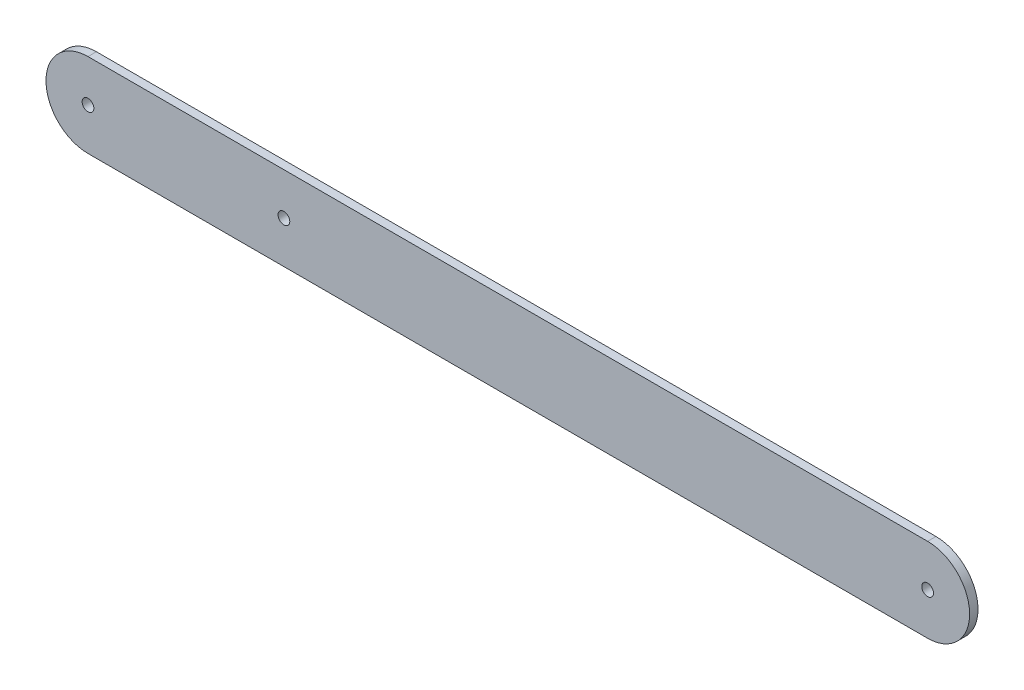
ISO-10303-21;
HEADER;
FILE_DESCRIPTION(('STEP AP214'),'2;1');
FILE_NAME('part.step','',(''),(''),'','','');
FILE_SCHEMA(('AUTOMOTIVE_DESIGN { 1 0 10303 214 1 1 1 1 }'));
ENDSEC;
DATA;
#1=APPLICATION_CONTEXT('core data for automotive mechanical design processes');
#2=APPLICATION_PROTOCOL_DEFINITION('international standard','automotive_design',2000,#1);
#3=PRODUCT_CONTEXT('',#1,'mechanical');
#4=PRODUCT('Part','Part','',(#3));
#5=PRODUCT_RELATED_PRODUCT_CATEGORY('part','',(#4));
#6=PRODUCT_DEFINITION_FORMATION('','',#4);
#7=PRODUCT_DEFINITION_CONTEXT('part definition',#1,'design');
#8=PRODUCT_DEFINITION('design','',#6,#7);
#9=PRODUCT_DEFINITION_SHAPE('','',#8);
#10=(LENGTH_UNIT() NAMED_UNIT(*) SI_UNIT(.MILLI.,.METRE.));
#11=(NAMED_UNIT(*) PLANE_ANGLE_UNIT() SI_UNIT($,.RADIAN.));
#12=(NAMED_UNIT(*) SI_UNIT($,.STERADIAN.) SOLID_ANGLE_UNIT());
#13=UNCERTAINTY_MEASURE_WITH_UNIT(LENGTH_MEASURE(1.E-05),#10,'distance_accuracy_value','');
#14=(GEOMETRIC_REPRESENTATION_CONTEXT(3) GLOBAL_UNCERTAINTY_ASSIGNED_CONTEXT((#13)) GLOBAL_UNIT_ASSIGNED_CONTEXT((#10,
#11,#12)) REPRESENTATION_CONTEXT('',''));
#15=CARTESIAN_POINT('',(0.,0.,0.));
#16=DIRECTION('',(0.,0.,1.));
#17=DIRECTION('',(1.,0.,0.));
#18=AXIS2_PLACEMENT_3D('',#15,#16,#17);
#19=CARTESIAN_POINT('',(150.,0.,3.));
#20=DIRECTION('',(0.,0.,-1.));
#21=DIRECTION('',(-1.,0.,0.));
#22=AXIS2_PLACEMENT_3D('',#19,#20,#21);
#23=PLANE('',#22);
#24=CARTESIAN_POINT('',(-80.,0.,3.));
#25=DIRECTION('',(0.,0.,1.));
#26=DIRECTION('',(1.,0.,0.));
#27=AXIS2_PLACEMENT_3D('',#24,#25,#26);
#28=CIRCLE('',#27,2.1);
#29=CARTESIAN_POINT('',(-77.9,0.,3.));
#30=VERTEX_POINT('',#29);
#31=EDGE_CURVE('E146',#30,#30,#28,.T.);
#32=ORIENTED_EDGE('',*,*,#31,.F.);
#33=EDGE_LOOP('',(#32));
#34=FACE_BOUND('',#33,.T.);
#35=DIRECTION('',(-1.,0.,0.));
#36=VECTOR('',#35,1.);
#37=CARTESIAN_POINT('',(0.,15.,3.));
#38=LINE('',#37,#36);
#39=CARTESIAN_POINT('',(150.,15.,3.));
#40=VERTEX_POINT('',#39);
#41=CARTESIAN_POINT('',(-150.,15.,3.));
#42=VERTEX_POINT('',#41);
#43=EDGE_CURVE('E75',#40,#42,#38,.T.);
#44=ORIENTED_EDGE('',*,*,#43,.T.);
#45=CARTESIAN_POINT('',(-150.,0.,3.));
#46=DIRECTION('',(0.,0.,-1.));
#47=DIRECTION('',(1.,0.,0.));
#48=AXIS2_PLACEMENT_3D('',#45,#46,#47);
#49=CIRCLE('',#48,15.);
#50=CARTESIAN_POINT('',(-150.,-15.,3.));
#51=VERTEX_POINT('',#50);
#52=EDGE_CURVE('E102',#51,#42,#49,.T.);
#53=ORIENTED_EDGE('',*,*,#52,.F.);
#54=DIRECTION('',(1.,0.,0.));
#55=VECTOR('',#54,1.);
#56=CARTESIAN_POINT('',(0.,-15.,3.));
#57=LINE('',#56,#55);
#58=CARTESIAN_POINT('',(150.,-15.,3.));
#59=VERTEX_POINT('',#58);
#60=EDGE_CURVE('E94',#51,#59,#57,.T.);
#61=ORIENTED_EDGE('',*,*,#60,.T.);
#62=CARTESIAN_POINT('',(150.,0.,3.));
#63=DIRECTION('',(0.,0.,1.));
#64=DIRECTION('',(-1.,0.,0.));
#65=AXIS2_PLACEMENT_3D('',#62,#63,#64);
#66=CIRCLE('',#65,15.);
#67=EDGE_CURVE('E58',#59,#40,#66,.T.);
#68=ORIENTED_EDGE('',*,*,#67,.T.);
#69=EDGE_LOOP('',(#44,#53,#61,#68));
#70=FACE_BOUND('',#69,.T.);
#71=CARTESIAN_POINT('',(150.,0.,3.));
#72=DIRECTION('',(0.,0.,1.));
#73=DIRECTION('',(1.,0.,0.));
#74=AXIS2_PLACEMENT_3D('',#71,#72,#73);
#75=CIRCLE('',#74,2.09999999999999);
#76=CARTESIAN_POINT('',(152.1,0.,3.));
#77=VERTEX_POINT('',#76);
#78=EDGE_CURVE('E117',#77,#77,#75,.T.);
#79=ORIENTED_EDGE('',*,*,#78,.F.);
#80=EDGE_LOOP('',(#79));
#81=FACE_BOUND('',#80,.T.);
#82=CARTESIAN_POINT('',(-150.,0.,3.));
#83=DIRECTION('',(0.,0.,-1.));
#84=DIRECTION('',(-1.,0.,0.));
#85=AXIS2_PLACEMENT_3D('',#82,#83,#84);
#86=CIRCLE('',#85,2.09999999999999);
#87=CARTESIAN_POINT('',(-152.1,0.,3.));
#88=VERTEX_POINT('',#87);
#89=EDGE_CURVE('E107',#88,#88,#86,.T.);
#90=ORIENTED_EDGE('',*,*,#89,.T.);
#91=EDGE_LOOP('',(#90));
#92=FACE_BOUND('',#91,.T.);
#93=ADVANCED_FACE('F41',(#34,#70,#81,#92),#23,.F.);
#94=CARTESIAN_POINT('',(150.,0.,0.));
#95=DIRECTION('',(0.,0.,-1.));
#96=DIRECTION('',(-1.,0.,0.));
#97=AXIS2_PLACEMENT_3D('',#94,#95,#96);
#98=PLANE('',#97);
#99=CARTESIAN_POINT('',(-80.,0.,0.));
#100=DIRECTION('',(0.,0.,1.));
#101=DIRECTION('',(1.,0.,0.));
#102=AXIS2_PLACEMENT_3D('',#99,#100,#101);
#103=CIRCLE('',#102,2.1);
#104=CARTESIAN_POINT('',(-77.9,0.,0.));
#105=VERTEX_POINT('',#104);
#106=EDGE_CURVE('E144',#105,#105,#103,.T.);
#107=ORIENTED_EDGE('',*,*,#106,.T.);
#108=EDGE_LOOP('',(#107));
#109=FACE_BOUND('',#108,.T.);
#110=DIRECTION('',(1.,0.,0.));
#111=VECTOR('',#110,1.);
#112=CARTESIAN_POINT('',(0.,-15.,0.));
#113=LINE('',#112,#111);
#114=CARTESIAN_POINT('',(-150.,-15.,0.));
#115=VERTEX_POINT('',#114);
#116=CARTESIAN_POINT('',(150.,-15.,0.));
#117=VERTEX_POINT('',#116);
#118=EDGE_CURVE('E69',#115,#117,#113,.T.);
#119=ORIENTED_EDGE('',*,*,#118,.F.);
#120=CARTESIAN_POINT('',(-150.,0.,0.));
#121=DIRECTION('',(0.,0.,-1.));
#122=DIRECTION('',(1.,0.,0.));
#123=AXIS2_PLACEMENT_3D('',#120,#121,#122);
#124=CIRCLE('',#123,15.);
#125=CARTESIAN_POINT('',(-150.,15.,0.));
#126=VERTEX_POINT('',#125);
#127=EDGE_CURVE('E101',#115,#126,#124,.T.);
#128=ORIENTED_EDGE('',*,*,#127,.T.);
#129=DIRECTION('',(-1.,0.,0.));
#130=VECTOR('',#129,1.);
#131=CARTESIAN_POINT('',(0.,15.,0.));
#132=LINE('',#131,#130);
#133=CARTESIAN_POINT('',(150.,15.,0.));
#134=VERTEX_POINT('',#133);
#135=EDGE_CURVE('E86',#134,#126,#132,.T.);
#136=ORIENTED_EDGE('',*,*,#135,.F.);
#137=CARTESIAN_POINT('',(150.,0.,0.));
#138=DIRECTION('',(0.,0.,1.));
#139=DIRECTION('',(-1.,0.,0.));
#140=AXIS2_PLACEMENT_3D('',#137,#138,#139);
#141=CIRCLE('',#140,15.);
#142=EDGE_CURVE('E95',#117,#134,#141,.T.);
#143=ORIENTED_EDGE('',*,*,#142,.F.);
#144=EDGE_LOOP('',(#119,#128,#136,#143));
#145=FACE_BOUND('',#144,.T.);
#146=CARTESIAN_POINT('',(150.,0.,0.));
#147=DIRECTION('',(0.,0.,1.));
#148=DIRECTION('',(1.,0.,0.));
#149=AXIS2_PLACEMENT_3D('',#146,#147,#148);
#150=CIRCLE('',#149,2.09999999999999);
#151=CARTESIAN_POINT('',(152.1,0.,0.));
#152=VERTEX_POINT('',#151);
#153=EDGE_CURVE('E116',#152,#152,#150,.T.);
#154=ORIENTED_EDGE('',*,*,#153,.T.);
#155=EDGE_LOOP('',(#154));
#156=FACE_BOUND('',#155,.T.);
#157=CARTESIAN_POINT('',(-150.,0.,0.));
#158=DIRECTION('',(0.,0.,-1.));
#159=DIRECTION('',(-1.,0.,0.));
#160=AXIS2_PLACEMENT_3D('',#157,#158,#159);
#161=CIRCLE('',#160,2.09999999999999);
#162=CARTESIAN_POINT('',(-152.1,0.,0.));
#163=VERTEX_POINT('',#162);
#164=EDGE_CURVE('E111',#163,#163,#161,.T.);
#165=ORIENTED_EDGE('',*,*,#164,.F.);
#166=EDGE_LOOP('',(#165));
#167=FACE_BOUND('',#166,.T.);
#168=ADVANCED_FACE('F105',(#109,#145,#156,#167),#98,.T.);
#169=CARTESIAN_POINT('',(0.,-15.,3.));
#170=DIRECTION('',(0.,1.,0.));
#171=DIRECTION('',(0.,0.,1.));
#172=AXIS2_PLACEMENT_3D('',#169,#170,#171);
#173=PLANE('',#172);
#174=ORIENTED_EDGE('',*,*,#118,.T.);
#175=DIRECTION('',(0.,0.,-1.));
#176=VECTOR('',#175,1.);
#177=CARTESIAN_POINT('',(150.,-15.,3.));
#178=LINE('',#177,#176);
#179=EDGE_CURVE('E11',#59,#117,#178,.T.);
#180=ORIENTED_EDGE('',*,*,#179,.F.);
#181=ORIENTED_EDGE('',*,*,#60,.F.);
#182=DIRECTION('',(0.,0.,-1.));
#183=VECTOR('',#182,1.);
#184=CARTESIAN_POINT('',(-150.,-15.,3.));
#185=LINE('',#184,#183);
#186=EDGE_CURVE('E103',#51,#115,#185,.T.);
#187=ORIENTED_EDGE('',*,*,#186,.T.);
#188=EDGE_LOOP('',(#174,#180,#181,#187));
#189=FACE_BOUND('',#188,.T.);
#190=ADVANCED_FACE('F43',(#189),#173,.F.);
#191=CARTESIAN_POINT('',(150.,0.,3.));
#192=DIRECTION('',(0.,0.,-1.));
#193=DIRECTION('',(-1.,0.,0.));
#194=AXIS2_PLACEMENT_3D('',#191,#192,#193);
#195=CYLINDRICAL_SURFACE('',#194,15.);
#196=ORIENTED_EDGE('',*,*,#142,.T.);
#197=DIRECTION('',(0.,0.,-1.));
#198=VECTOR('',#197,1.);
#199=CARTESIAN_POINT('',(150.,15.,3.));
#200=LINE('',#199,#198);
#201=EDGE_CURVE('E50',#40,#134,#200,.T.);
#202=ORIENTED_EDGE('',*,*,#201,.F.);
#203=ORIENTED_EDGE('',*,*,#67,.F.);
#204=ORIENTED_EDGE('',*,*,#179,.T.);
#205=EDGE_LOOP('',(#196,#202,#203,#204));
#206=FACE_BOUND('',#205,.T.);
#207=ADVANCED_FACE('F127',(#206),#195,.T.);
#208=CARTESIAN_POINT('',(0.,15.,3.));
#209=DIRECTION('',(0.,-1.,0.));
#210=DIRECTION('',(0.,0.,-1.));
#211=AXIS2_PLACEMENT_3D('',#208,#209,#210);
#212=PLANE('',#211);
#213=ORIENTED_EDGE('',*,*,#135,.T.);
#214=DIRECTION('',(0.,0.,-1.));
#215=VECTOR('',#214,1.);
#216=CARTESIAN_POINT('',(-150.,15.,3.));
#217=LINE('',#216,#215);
#218=EDGE_CURVE('E89',#42,#126,#217,.T.);
#219=ORIENTED_EDGE('',*,*,#218,.F.);
#220=ORIENTED_EDGE('',*,*,#43,.F.);
#221=ORIENTED_EDGE('',*,*,#201,.T.);
#222=EDGE_LOOP('',(#213,#219,#220,#221));
#223=FACE_BOUND('',#222,.T.);
#224=ADVANCED_FACE('F88',(#223),#212,.F.);
#225=CARTESIAN_POINT('',(150.,0.,3.));
#226=DIRECTION('',(0.,0.,-1.));
#227=DIRECTION('',(-1.,0.,0.));
#228=AXIS2_PLACEMENT_3D('',#225,#226,#227);
#229=CYLINDRICAL_SURFACE('',#228,2.09999999999999);
#230=ORIENTED_EDGE('',*,*,#78,.T.);
#231=EDGE_LOOP('',(#230));
#232=FACE_BOUND('',#231,.T.);
#233=ORIENTED_EDGE('',*,*,#153,.F.);
#234=EDGE_LOOP('',(#233));
#235=FACE_BOUND('',#234,.T.);
#236=ADVANCED_FACE('F161',(#232,#235),#229,.F.);
#237=CARTESIAN_POINT('',(-150.,0.,3.));
#238=DIRECTION('',(0.,0.,-1.));
#239=DIRECTION('',(1.,0.,0.));
#240=AXIS2_PLACEMENT_3D('',#237,#238,#239);
#241=CYLINDRICAL_SURFACE('',#240,15.);
#242=ORIENTED_EDGE('',*,*,#127,.F.);
#243=ORIENTED_EDGE('',*,*,#186,.F.);
#244=ORIENTED_EDGE('',*,*,#52,.T.);
#245=ORIENTED_EDGE('',*,*,#218,.T.);
#246=EDGE_LOOP('',(#242,#243,#244,#245));
#247=FACE_BOUND('',#246,.T.);
#248=ADVANCED_FACE('F99',(#247),#241,.T.);
#249=CARTESIAN_POINT('',(-150.,0.,3.));
#250=DIRECTION('',(0.,0.,-1.));
#251=DIRECTION('',(1.,0.,0.));
#252=AXIS2_PLACEMENT_3D('',#249,#250,#251);
#253=CYLINDRICAL_SURFACE('',#252,2.09999999999999);
#254=ORIENTED_EDGE('',*,*,#89,.F.);
#255=EDGE_LOOP('',(#254));
#256=FACE_BOUND('',#255,.T.);
#257=ORIENTED_EDGE('',*,*,#164,.T.);
#258=EDGE_LOOP('',(#257));
#259=FACE_BOUND('',#258,.T.);
#260=ADVANCED_FACE('F136',(#256,#259),#253,.F.);
#261=CARTESIAN_POINT('',(-80.,0.,0.));
#262=DIRECTION('',(0.,0.,1.));
#263=DIRECTION('',(1.,0.,0.));
#264=AXIS2_PLACEMENT_3D('',#261,#262,#263);
#265=CYLINDRICAL_SURFACE('',#264,2.1);
#266=ORIENTED_EDGE('',*,*,#106,.F.);
#267=EDGE_LOOP('',(#266));
#268=FACE_BOUND('',#267,.T.);
#269=ORIENTED_EDGE('',*,*,#31,.T.);
#270=EDGE_LOOP('',(#269));
#271=FACE_BOUND('',#270,.T.);
#272=ADVANCED_FACE('F139',(#268,#271),#265,.F.);
#273=CLOSED_SHELL('',(#93,#168,#190,#207,#224,#236,#248,#260,#272));
#274=MANIFOLD_SOLID_BREP('B2',#273);
#275=ADVANCED_BREP_SHAPE_REPRESENTATION('',(#18,#274),#14);
#276=SHAPE_DEFINITION_REPRESENTATION(#9,#275);
ENDSEC;
END-ISO-10303-21;
